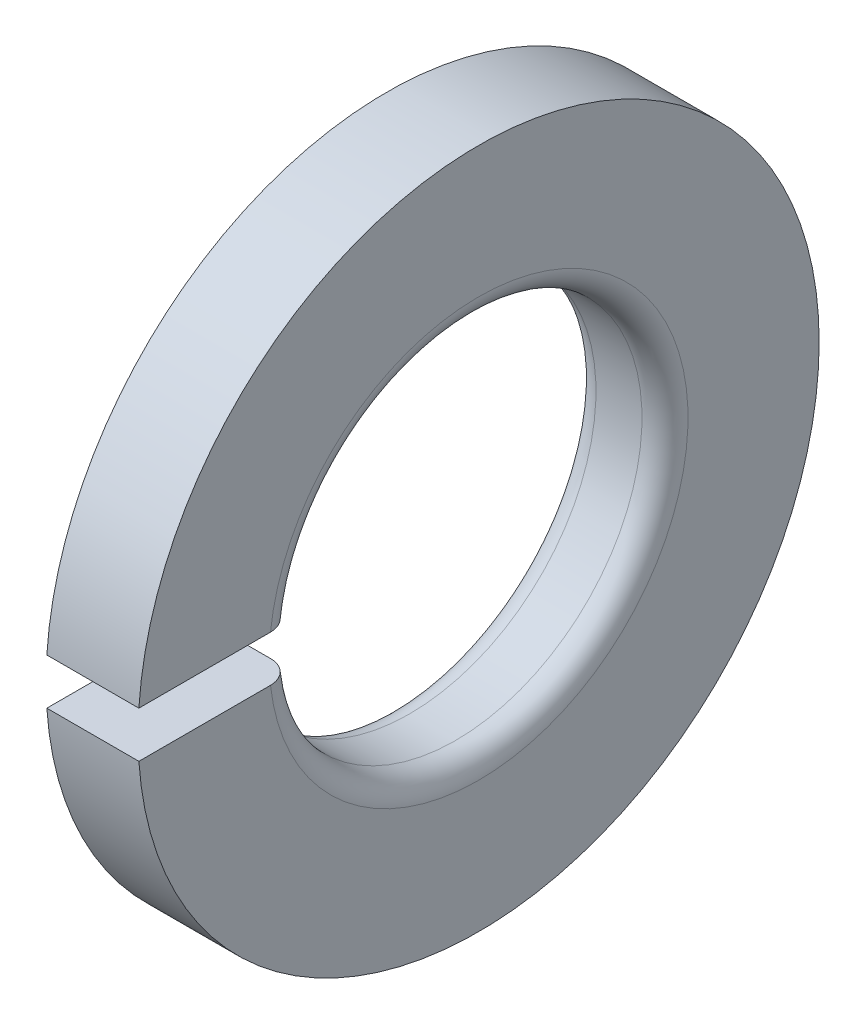
ISO-10303-21;
HEADER;
FILE_DESCRIPTION(('STEP AP214'),'2;1');
FILE_NAME('part.step','',(''),(''),'','','');
FILE_SCHEMA(('AUTOMOTIVE_DESIGN { 1 0 10303 214 1 1 1 1 }'));
ENDSEC;
DATA;
#1=APPLICATION_CONTEXT('core data for automotive mechanical design processes');
#2=APPLICATION_PROTOCOL_DEFINITION('international standard','automotive_design',2000,#1);
#3=PRODUCT_CONTEXT('',#1,'mechanical');
#4=PRODUCT('Part','Part','',(#3));
#5=PRODUCT_RELATED_PRODUCT_CATEGORY('part','',(#4));
#6=PRODUCT_DEFINITION_FORMATION('','',#4);
#7=PRODUCT_DEFINITION_CONTEXT('part definition',#1,'design');
#8=PRODUCT_DEFINITION('design','',#6,#7);
#9=PRODUCT_DEFINITION_SHAPE('','',#8);
#10=(LENGTH_UNIT() NAMED_UNIT(*) SI_UNIT(.MILLI.,.METRE.));
#11=(NAMED_UNIT(*) PLANE_ANGLE_UNIT() SI_UNIT($,.RADIAN.));
#12=(NAMED_UNIT(*) SI_UNIT($,.STERADIAN.) SOLID_ANGLE_UNIT());
#13=UNCERTAINTY_MEASURE_WITH_UNIT(LENGTH_MEASURE(1.E-05),#10,'distance_accuracy_value','');
#14=(GEOMETRIC_REPRESENTATION_CONTEXT(3) GLOBAL_UNCERTAINTY_ASSIGNED_CONTEXT((#13)) GLOBAL_UNIT_ASSIGNED_CONTEXT((#10,
#11,#12)) REPRESENTATION_CONTEXT('',''));
#15=CARTESIAN_POINT('',(0.,0.,0.));
#16=DIRECTION('',(0.,0.,1.));
#17=DIRECTION('',(1.,0.,0.));
#18=AXIS2_PLACEMENT_3D('',#15,#16,#17);
#19=CARTESIAN_POINT('',(-1.99999999999623,0.500000000004719,7.54800000000022));
#20=DIRECTION('',(0.,-1.,0.));
#21=DIRECTION('',(0.,0.,-0.99999999999996));
#22=AXIS2_PLACEMENT_3D('',#19,#20,#21);
#23=PLANE('',#22);
#24=DIRECTION('',(-1.00000000000014,0.,0.));
#25=VECTOR('',#24,1.);
#26=CARTESIAN_POINT('',(-34.9249999999923,0.500000000000833,7.38308878451444));
#27=LINE('',#26,#25);
#28=CARTESIAN_POINT('',(-2.66453525910038E-12,0.50000000000594,7.38308878451033));
#29=VERTEX_POINT('',#28);
#30=CARTESIAN_POINT('',(-1.99999999999534,0.500000000003498,7.38308878451288));
#31=VERTEX_POINT('',#30);
#32=EDGE_CURVE('E301',#29,#31,#27,.T.);
#33=ORIENTED_EDGE('',*,*,#32,.T.);
#34=DIRECTION('',(0.,0.,-0.99999999999996));
#35=VECTOR('',#34,1.);
#36=CARTESIAN_POINT('',(-2.00000000000511,0.500000000011935,7.105427357601E-12));
#37=LINE('',#36,#35);
#38=CARTESIAN_POINT('',(-2.00000000000156,0.499999999992062,4.52244402951574));
#39=VERTEX_POINT('',#38);
#40=EDGE_CURVE('E27',#31,#39,#37,.T.);
#41=ORIENTED_EDGE('',*,*,#40,.T.);
#42=CARTESIAN_POINT('',(-1.5000000000072,0.499999999999545,4.01901729281855));
#43=CARTESIAN_POINT('',(-1.50748561508938,0.499999953272909,4.01901716552028));
#44=CARTESIAN_POINT('',(-1.51497121608091,0.499997602261344,4.01918698453235));
#45=CARTESIAN_POINT('',(-1.53002362041601,0.499989714503642,4.01986976163311));
#46=CARTESIAN_POINT('',(-1.53759022431912,0.499984137017275,4.02038712180304));
#47=CARTESIAN_POINT('',(-1.55278828122433,0.49997121460027,4.02177705523689));
#48=CARTESIAN_POINT('',(-1.56041932685544,0.49996384798885,4.02265408442562));
#49=CARTESIAN_POINT('',(-1.57572878326871,0.499948539550349,4.02477458826429));
#50=CARTESIAN_POINT('',(-1.5834065713466,0.499940591623654,4.02602255983972));
#51=CARTESIAN_POINT('',(-1.59879088195947,0.499925160094014,4.02889548817222));
#52=CARTESIAN_POINT('',(-1.60649655918682,0.499917683556597,4.03052497247465));
#53=CARTESIAN_POINT('',(-1.62191688975636,0.499904042546268,4.0341706122172));
#54=CARTESIAN_POINT('',(-1.62963046847135,0.499897895501641,4.03619131393224));
#55=CARTESIAN_POINT('',(-1.64504573436087,0.499887561105904,4.04062814092714));
#56=CARTESIAN_POINT('',(-1.65274611137995,0.499883398756564,4.04304881889016));
#57=CARTESIAN_POINT('',(-1.668113024944,0.499877465506405,4.04829331243764));
#58=CARTESIAN_POINT('',(-1.67577801018735,0.499875724314375,4.0511216740783));
#59=CARTESIAN_POINT('',(-1.69105114513187,0.499874833876619,4.05718811040265));
#60=CARTESIAN_POINT('',(-1.69865749740467,0.499875716112147,4.06043071085659));
#61=CARTESIAN_POINT('',(-1.71378936982724,0.49988003537121,4.06733095833115));
#62=CARTESIAN_POINT('',(-1.72131284215068,0.499883502756743,4.0709930965461));
#63=CARTESIAN_POINT('',(-1.73625400628867,0.499892677766569,4.07873640808514));
#64=CARTESIAN_POINT('',(-1.74366939633286,0.499898411388501,4.08282202313595));
#65=CARTESIAN_POINT('',(-1.75836856837313,0.499911618149696,4.09141482733663));
#66=CARTESIAN_POINT('',(-1.76564979205833,0.499919110874341,4.0959263932586));
#67=CARTESIAN_POINT('',(-1.78005395439421,0.499934747047213,4.10537208982442));
#68=CARTESIAN_POINT('',(-1.78717407599416,0.499942897037337,4.11031051629181));
#69=CARTESIAN_POINT('',(-1.80122874624811,0.499959646906156,4.12060925946825));
#70=CARTESIAN_POINT('',(-1.80816021968402,0.499968250880354,4.12597377436082));
#71=CARTESIAN_POINT('',(-1.82180918753309,0.499980947236283,4.13712231342917));
#72=CARTESIAN_POINT('',(-1.82852334326952,0.499984987086652,4.14291042164119));
#73=CARTESIAN_POINT('',(-1.84171052376815,0.500000239595588,4.15490174357232));
#74=CARTESIAN_POINT('',(-1.84817996803468,0.500011532761928,4.16110890773137));
#75=CARTESIAN_POINT('',(-1.85631852921631,0.499996625865646,4.16935055511182));
#76=CARTESIAN_POINT('',(-1.85814585930569,0.499991297903434,4.17123049543251));
#77=CARTESIAN_POINT('',(-1.86228406801692,0.499970246712779,4.17555608481707));
#78=CARTESIAN_POINT('',(-1.8645852153982,0.49995200530595,4.17801106197889));
#79=CARTESIAN_POINT('',(-1.86964037825593,0.499909775696944,4.18351397702914));
#80=CARTESIAN_POINT('',(-1.87238217617192,0.499885408016754,4.18657313325353));
#81=CARTESIAN_POINT('',(-1.87827923293826,0.499831937756961,4.19331710505004));
#82=CARTESIAN_POINT('',(-1.88141955911796,0.499802776082484,4.19701498964861));
#83=CARTESIAN_POINT('',(-1.88806510530111,0.499743010873845,4.20507320743247));
#84=CARTESIAN_POINT('',(-1.89155252148393,0.499712870895155,4.20944823644231));
#85=CARTESIAN_POINT('',(-1.89883363819062,0.499654023650828,4.21890066296193));
#86=CARTESIAN_POINT('',(-1.90260647281742,0.49962603875564,4.22399415030097));
#87=CARTESIAN_POINT('',(-1.91038901028965,0.499574572805987,4.23492508430324));
#88=CARTESIAN_POINT('',(-1.91437459372639,0.499552004976681,4.24077971982574));
#89=CARTESIAN_POINT('',(-1.92250163547388,0.499514095421726,4.25327462743974));
#90=CARTESIAN_POINT('',(-1.92661552850864,0.499499761090574,4.25993284982627));
#91=CARTESIAN_POINT('',(-1.93490583138315,0.49948052143504,4.27407452737618));
#92=CARTESIAN_POINT('',(-1.93905103558709,0.499476641518321,4.28157627888969));
#93=CARTESIAN_POINT('',(-1.94729805821081,0.499479679903175,4.2974412262524));
#94=CARTESIAN_POINT('',(-1.95136488761893,0.499487564604471,4.30582268000173));
#95=CARTESIAN_POINT('',(-1.95722771209192,0.499507271593149,4.31880695109538));
#96=CARTESIAN_POINT('',(-1.9591926487224,0.499515501572604,4.32333429622484));
#97=CARTESIAN_POINT('',(-1.96306074256105,0.499534700332774,4.33261641197448));
#98=CARTESIAN_POINT('',(-1.96495877990835,0.499545760649247,4.33737332293312));
#99=CARTESIAN_POINT('',(-1.96867574723157,0.499570403205374,4.34711638993613));
#100=CARTESIAN_POINT('',(-1.97048929895053,0.499584062461406,4.35210459642447));
#101=CARTESIAN_POINT('',(-1.97401927491285,0.49961356999571,4.36231148460286));
#102=CARTESIAN_POINT('',(-1.97573006530324,0.49962947822747,4.36753211558344));
#103=CARTESIAN_POINT('',(-1.97903567750591,0.499663025932473,4.37820410316804));
#104=CARTESIAN_POINT('',(-1.98062460791997,0.499680705796024,4.38365728495089));
#105=CARTESIAN_POINT('',(-1.9836669121791,0.499717203065506,4.39479361691822));
#106=CARTESIAN_POINT('',(-1.9851141378086,0.499736038762799,4.40047844729326));
#107=CARTESIAN_POINT('',(-1.98785272596338,0.499774107811786,4.41207617708927));
#108=CARTESIAN_POINT('',(-1.98913768498556,0.499793334814477,4.41799058920652));
#109=CARTESIAN_POINT('',(-1.99153076984537,0.499831290227347,4.43004433329153));
#110=CARTESIAN_POINT('',(-1.99263223992184,0.499849985104897,4.43618498739852));
#111=CARTESIAN_POINT('',(-1.99463677167566,0.499885813808528,4.44868669887748));
#112=CARTESIAN_POINT('',(-1.99553292974262,0.499902884382857,4.45504886400023));
#113=CARTESIAN_POINT('',(-1.99710474164608,0.499934226852415,4.46798759693777));
#114=CARTESIAN_POINT('',(-1.99777325036995,0.499948403273798,4.47456503365268));
#115=CARTESIAN_POINT('',(-1.99886719354286,0.499972534738432,4.48792670984609));
#116=CARTESIAN_POINT('',(-1.99928524831778,0.499982359583994,4.49471155440364));
#117=CARTESIAN_POINT('',(-1.99985549590138,0.499996177224051,4.50847872578808));
#118=CARTESIAN_POINT('',(-2.0000000876899,0.500000002788135,4.51546136830327));
#119=CARTESIAN_POINT('',(-2.00000000000728,0.499999999999558,4.52244402950122));
#120=B_SPLINE_CURVE_WITH_KNOTS('',3,(#42,#43,#44,#45,#46,#47,#48,#49,#50,#51,#52,#53,#54,#55,
#56,#57,#58,#59,#60,#61,#62,#63,#64,#65,#66,#67,#68,#69,#70,#71,#72,#73,#74,#75,#76,#77,#78,#79,
#80,#81,#82,#83,#84,#85,#86,#87,#88,#89,#90,#91,#92,#93,#94,#95,#96,#97,#98,#99,#100,#101,#102,
#103,#104,#105,#106,#107,#108,#109,#110,#111,#112,#113,#114,#115,#116,#117,#118,#119),
.UNSPECIFIED.,.F.,.F.,(4,2,2,2,2,2,2,2,2,2,2,2,2,2,2,2,2,2,2,2,2,2,2,2,2,2,2,2,2,2,2,2,2,2,2,2,
2,2,4),(0.,0.0224549112175778,0.0451997457757097,0.0682353125981372,0.0915623954254549,
0.115181756728255,0.139094141520749,0.163300281070073,0.187800896495049,0.212596702246624,
0.237688409460583,0.263076729171398,0.288762375374257,0.314746067920404,0.341028535228959,
0.367610516796397,0.394492765482802,0.402357690103795,0.412451617757568,0.424774711493981,
0.439327115464466,0.45610898049943,0.475120476895091,0.496361802576542,0.519833189257198,
0.545534907487324,0.573467270828169,0.58827164010673,0.603633995305254,0.619554402975488,
0.636032933246071,0.653069659796546,0.670664659796565,0.688818013805997,0.707529805631366,
0.726800122133813,0.746629052983607,0.767016690356106,0.787963128563953),.UNSPECIFIED.);
#121=CARTESIAN_POINT('',(-1.50000000002137,0.500000000001832,4.01901729281673));
#122=VERTEX_POINT('',#121);
#123=EDGE_CURVE('E203',#122,#39,#120,.T.);
#124=ORIENTED_EDGE('',*,*,#123,.F.);
#125=DIRECTION('',(1.00000000000014,0.,0.));
#126=VECTOR('',#125,1.);
#127=CARTESIAN_POINT('',(-34.9250000000021,0.499999999995615,4.01901729281862));
#128=LINE('',#127,#126);
#129=CARTESIAN_POINT('',(-0.500000000014822,0.500000000000944,4.0190172928124));
#130=VERTEX_POINT('',#129);
#131=EDGE_CURVE('E96',#122,#130,#128,.T.);
#132=ORIENTED_EDGE('',*,*,#131,.T.);
#133=CARTESIAN_POINT('',(-4.13829127215992E-12,0.499999999999658,4.52244402950488));
#134=CARTESIAN_POINT('',(8.78582804622334E-08,0.500000002788944,4.5154578184117));
#135=CARTESIAN_POINT('',(-0.000144651072075563,0.49999617098689,4.50847162602091));
#136=CARTESIAN_POINT('',(-0.00071548582687301,0.49998233026018,4.49469729296484));
#137=CARTESIAN_POINT('',(-0.00113397994639846,0.499972488693761,4.48790883642249));
#138=CARTESIAN_POINT('',(-0.00222909145849578,0.499948315243477,4.47453989133131));
#139=CARTESIAN_POINT('',(-0.0028983283327819,0.499934113671153,4.46795879731763));
#140=CARTESIAN_POINT('',(-0.00447188137272107,0.499902714329723,4.45501272057473));
#141=CARTESIAN_POINT('',(-0.00536905143986357,0.499885612133517,4.44864686835663));
#142=CARTESIAN_POINT('',(-0.00737588612132155,0.499849715481703,4.4361377678786));
#143=CARTESIAN_POINT('',(-0.00847864600981831,0.499830984361436,4.42999341107155));
#144=CARTESIAN_POINT('',(-0.0108745824688362,0.499792953503831,4.41793225980601));
#145=CARTESIAN_POINT('',(-0.0121611020459157,0.499773687366853,4.41201414220119));
#146=CARTESIAN_POINT('',(-0.0149030754484896,0.499735538704053,4.40040901127226));
#147=CARTESIAN_POINT('',(-0.0163521244331994,0.499716662578951,4.39472048403216));
#148=CARTESIAN_POINT('',(-0.0193983309376364,0.499680084582847,4.3835767783776));
#149=CARTESIAN_POINT('',(-0.0209893388093471,0.499662364456277,4.37811991833947));
#150=CARTESIAN_POINT('',(-0.0242993522275669,0.499628737681773,4.36744060304097));
#151=CARTESIAN_POINT('',(-0.0260124648580352,0.499612790663728,4.36221632095584));
#152=CARTESIAN_POINT('',(-0.0295473218063634,0.499583208188126,4.35200216673041));
#153=CARTESIAN_POINT('',(-0.0313634306772503,0.49956951278226,4.34701034344143));
#154=CARTESIAN_POINT('',(-0.0350857387109606,0.499544801578208,4.3372600847776));
#155=CARTESIAN_POINT('',(-0.0369865579514607,0.499533708754553,4.33249959689341));
#156=CARTESIAN_POINT('',(-0.0408604311355706,0.499514449486569,4.32321037420345));
#157=CARTESIAN_POINT('',(-0.0428283634971406,0.499506191484338,4.31867949677905));
#158=CARTESIAN_POINT('',(-0.0487004600756688,0.499486409213047,4.30568456103192));
#159=CARTESIAN_POINT('',(-0.0527738863633262,0.499478483934712,4.2972961751318));
#160=CARTESIAN_POINT('',(-0.0610348417885195,0.499475389270068,4.28141758425333));
#161=CARTESIAN_POINT('',(-0.065187366826513,0.499479253049495,4.27390909836512));
#162=CARTESIAN_POINT('',(-0.0734929634913855,0.499498486518159,4.25975416104117));
#163=CARTESIAN_POINT('',(-0.0776148135456418,0.499512830275646,4.25308938734216));
#164=CARTESIAN_POINT('',(-0.0857583341512029,0.499550783604497,4.2405815577697));
#165=CARTESIAN_POINT('',(-0.0897524226691077,0.49957338523884,4.23472052287831));
#166=CARTESIAN_POINT('',(-0.0975524499065559,0.499624940107158,4.22377692454164));
#167=CARTESIAN_POINT('',(-0.101334251517573,0.499652979664338,4.21867714093173));
#168=CARTESIAN_POINT('',(-0.108633698546621,0.499711952193922,4.20921219447099));
#169=CARTESIAN_POINT('',(-0.112130459257786,0.499742162469756,4.20483090811444));
#170=CARTESIAN_POINT('',(-0.118795009550483,0.499802075833275,4.19676017242977));
#171=CARTESIAN_POINT('',(-0.121944975137716,0.499831315459909,4.1930559914486));
#172=CARTESIAN_POINT('',(-0.127861545397101,0.499884942108848,4.18629933551338));
#173=CARTESIAN_POINT('',(-0.130613195609282,0.499909388017785,4.18323375382062));
#174=CARTESIAN_POINT('',(-0.135688217901568,0.499951759090465,4.17771779770785));
#175=CARTESIAN_POINT('',(-0.137999348545125,0.499970065217768,4.17525616552488));
#176=CARTESIAN_POINT('',(-0.142157595961802,0.4999912278129,4.17091696863508));
#177=CARTESIAN_POINT('',(-0.143994955674154,0.49999659694027,4.1690300352828));
#178=CARTESIAN_POINT('',(-0.152140091847633,0.500011561307792,4.16079683117086));
#179=CARTESIAN_POINT('',(-0.158605284749574,0.500000430581791,4.15460461343572));
#180=CARTESIAN_POINT('',(-0.171783033968526,0.49998542728062,4.14264199210805));
#181=CARTESIAN_POINT('',(-0.178492036463244,0.499981475305023,4.13686766095693));
#182=CARTESIAN_POINT('',(-0.192129906643335,0.499968961029165,4.12574546849947));
#183=CARTESIAN_POINT('',(-0.199055460483642,0.499960450984341,4.12039354722201));
#184=CARTESIAN_POINT('',(-0.213097644077318,0.499943866107831,4.11011877979264));
#185=CARTESIAN_POINT('',(-0.220211221390249,0.499935787438632,4.10519176054492));
#186=CARTESIAN_POINT('',(-0.234601782545235,0.499920273258884,4.09576767537517));
#187=CARTESIAN_POINT('',(-0.241875970113177,0.499912831453615,4.09126633956999));
#188=CARTESIAN_POINT('',(-0.256560686353494,0.499899702179977,4.08269281183593));
#189=CARTESIAN_POINT('',(-0.263968675488303,0.499893995470885,4.07861626976814));
#190=CARTESIAN_POINT('',(-0.278894775887238,0.499884849925421,4.07088994966593));
#191=CARTESIAN_POINT('',(-0.28641060217731,0.499881385468387,4.06723575707673));
#192=CARTESIAN_POINT('',(-0.301527034630219,0.499877048740609,4.0603502844622));
#193=CARTESIAN_POINT('',(-0.309125607817531,0.499876146498073,4.05711454080666));
#194=CARTESIAN_POINT('',(-0.324383142631468,0.499876976217089,4.05106074772426));
#195=CARTESIAN_POINT('',(-0.332040319776743,0.49987867706973,4.04823820034434));
#196=CARTESIAN_POINT('',(-0.347391672792108,0.499884512844785,4.04300431790366));
#197=CARTESIAN_POINT('',(-0.355084308453213,0.499888618385357,4.04058846472569));
#198=CARTESIAN_POINT('',(-0.370484236354603,0.499898827476793,4.03616032876214));
#199=CARTESIAN_POINT('',(-0.378190227734414,0.499904906279511,4.03414352123092));
#200=CARTESIAN_POINT('',(-0.393595608818486,0.499918405289573,4.03050477519817));
#201=CARTESIAN_POINT('',(-0.401293931455855,0.499925808221696,4.02887831824253));
#202=CARTESIAN_POINT('',(-0.416663829886207,0.499941094113053,4.02601061791647));
#203=CARTESIAN_POINT('',(-0.424334566265778,0.499948970032831,4.02476487459816));
#204=CARTESIAN_POINT('',(-0.439630279513462,0.499964143949599,4.02264807185205));
#205=CARTESIAN_POINT('',(-0.447254637978504,0.499971447918642,4.02177254277265));
#206=CARTESIAN_POINT('',(-0.462439735522376,0.499984262999869,4.02038492766572));
#207=CARTESIAN_POINT('',(-0.470000070016233,0.499989795489107,4.01986841257786));
#208=CARTESIAN_POINT('',(-0.485040397063862,0.499997620663045,4.01918671956441));
#209=CARTESIAN_POINT('',(-0.49252019152618,0.499999953573932,4.01901716591152));
#210=CARTESIAN_POINT('',(-0.500000000004204,0.499999999999656,4.01901729282222));
#211=B_SPLINE_CURVE_WITH_KNOTS('',3,(#133,#134,#135,#136,#137,#138,#139,#140,#141,#142,#143,
#144,#145,#146,#147,#148,#149,#150,#151,#152,#153,#154,#155,#156,#157,#158,#159,#160,#161,#162,
#163,#164,#165,#166,#167,#168,#169,#170,#171,#172,#173,#174,#175,#176,#177,#178,#179,#180,#181,
#182,#183,#184,#185,#186,#187,#188,#189,#190,#191,#192,#193,#194,#195,#196,#197,#198,#199,#200,
#201,#202,#203,#204,#205,#206,#207,#208,#209,#210),.UNSPECIFIED.,.F.,.F.,(4,2,2,2,2,2,2,2,2,2,2,
2,2,2,2,2,2,2,2,2,2,2,2,2,2,2,2,2,2,2,2,2,2,2,2,2,2,2,4),(0.,0.0209570855649429,
0.0413556106550284,0.0611956696427081,0.0804773547659454,0.0992007557597671,0.117365959551616,
0.13497305001533,0.152022107778639,0.168513210079185,0.184446430664288,0.199821839729865,
0.214639503894216,0.242599172471596,0.268329161752777,0.291829785775131,0.313101315542838,
0.332143983209899,0.34895798714381,0.363543498108731,0.37590066746475,0.386029640006872,
0.393930579593988,0.420772661026481,0.44731600522424,0.473561363143571,0.499509472434382,
0.525161059714043,0.550516843062365,0.575577534717071,0.600343843951035,0.624816480114624,
0.648996155828348,0.672883590312971,0.696479512845962,0.719784666334935,0.742799811000282,
0.765525728160772,0.787963224117252),.UNSPECIFIED.);
#212=CARTESIAN_POINT('',(-8.88178419700125E-13,0.499999999987066,4.52244402951296));
#213=VERTEX_POINT('',#212);
#214=EDGE_CURVE('E125',#213,#130,#211,.T.);
#215=ORIENTED_EDGE('',*,*,#214,.F.);
#216=DIRECTION('',(0.,0.,-0.99999999999996));
#217=VECTOR('',#216,1.);
#218=CARTESIAN_POINT('',(5.32907051820075E-12,0.500000000012824,7.548));
#219=LINE('',#218,#217);
#220=EDGE_CURVE('E130',#29,#213,#219,.T.);
#221=ORIENTED_EDGE('',*,*,#220,.F.);
#222=EDGE_LOOP('',(#33,#41,#124,#132,#215,#221));
#223=FACE_BOUND('',#222,.T.);
#224=ADVANCED_FACE('F16',(#223),#23,.T.);
#225=CARTESIAN_POINT('',(-2.0000000000131,-0.499999999994061,2.77555756156289E-12));
#226=DIRECTION('',(0.,1.,0.));
#227=DIRECTION('',(1.00000000000014,0.,0.));
#228=AXIS2_PLACEMENT_3D('',#225,#226,#227);
#229=PLANE('',#228);
#230=DIRECTION('',(1.00000000000014,0.,0.));
#231=VECTOR('',#230,1.);
#232=CARTESIAN_POINT('',(-34.9249999999945,-0.499999999988621,7.38308878451621));
#233=LINE('',#232,#231);
#234=CARTESIAN_POINT('',(-1.99999999998646,-0.499999999988954,7.38308878450467));
#235=VERTEX_POINT('',#234);
#236=CARTESIAN_POINT('',(2.66453525910038E-12,-0.50000000000272,7.3830887845111));
#237=VERTEX_POINT('',#236);
#238=EDGE_CURVE('E118',#235,#237,#233,.T.);
#239=ORIENTED_EDGE('',*,*,#238,.T.);
#240=DIRECTION('',(0.,0.,0.99999999999996));
#241=VECTOR('',#240,1.);
#242=CARTESIAN_POINT('',(1.68753899743024E-11,-0.500000000002498,4.10782519111308E-12));
#243=LINE('',#242,#241);
#244=CARTESIAN_POINT('',(-7.105427357601E-12,-0.500000000010159,4.52244402949986));
#245=VERTEX_POINT('',#244);
#246=EDGE_CURVE('E89',#245,#237,#243,.T.);
#247=ORIENTED_EDGE('',*,*,#246,.F.);
#248=CARTESIAN_POINT('',(-0.500000000004214,-0.500000000000453,4.01901729282223));
#249=CARTESIAN_POINT('',(-0.492514516692793,-0.499999953278564,4.01901716553286));
#250=CARTESIAN_POINT('',(-0.485029047470629,-0.49999760248498,4.01918697854489));
#251=CARTESIAN_POINT('',(-0.469976912546314,-0.49998971546219,4.01986973133121));
#252=CARTESIAN_POINT('',(-0.462410446263705,-0.499984138498659,4.02038707280279));
#253=CARTESIAN_POINT('',(-0.447212669542019,-0.499971217299528,4.0217769554587));
#254=CARTESIAN_POINT('',(-0.439581766430841,-0.499963851386319,4.02265395217703));
#255=CARTESIAN_POINT('',(-0.424272598948772,-0.499948544408026,4.02477437668269));
#256=CARTESIAN_POINT('',(-0.416594957215767,-0.499940597244271,4.02602230099944));
#257=CARTESIAN_POINT('',(-0.401210942007636,-0.499925167207225,4.02889511946222));
#258=CARTESIAN_POINT('',(-0.393505413749372,-0.499917691398513,4.03052454075364));
#259=CARTESIAN_POINT('',(-0.378085382531681,-0.499904051730991,4.03417003822963));
#260=CARTESIAN_POINT('',(-0.370371954083294,-0.499897905298022,4.03619066028682));
#261=CARTESIAN_POINT('',(-0.354956988715052,-0.499887571946758,4.04062731090902));
#262=CARTESIAN_POINT('',(-0.347256761808152,-0.499883410026689,4.04304789175422));
#263=CARTESIAN_POINT('',(-0.331890146908525,-0.499877477411161,4.04829217329017));
#264=CARTESIAN_POINT('',(-0.324225310047751,-0.499875736420257,4.0511204196353));
#265=CARTESIAN_POINT('',(-0.308952468641225,-0.499874846136971,4.05718660698126));
#266=CARTESIAN_POINT('',(-0.301346261326244,-0.499875728321332,4.06042907335357));
#267=CARTESIAN_POINT('',(-0.286214673810229,-0.499880047228918,4.06732903378788));
#268=CARTESIAN_POINT('',(-0.278691341209399,-0.499883514309767,4.0709910186505));
#269=CARTESIAN_POINT('',(-0.263750449616649,-0.499892688486061,4.07873400425463));
#270=CARTESIAN_POINT('',(-0.256335192139923,-0.499898421575366,4.08281944633636));
#271=CARTESIAN_POINT('',(-0.241636276343165,-0.499911627092163,4.09141188516601));
#272=CARTESIAN_POINT('',(-0.234355176049448,-0.499919119102157,4.09592325830897));
#273=CARTESIAN_POINT('',(-0.219951249518596,-0.499934753763611,4.10536854984816));
#274=CARTESIAN_POINT('',(-0.212831240018,-0.499942902955861,4.11030676370265));
#275=CARTESIAN_POINT('',(-0.198776780827672,-0.499959651180304,4.12060506232445));
#276=CARTESIAN_POINT('',(-0.191845406012349,-0.499968254307411,4.12596934492417));
#277=CARTESIAN_POINT('',(-0.178196620001634,-0.499980949339561,4.13711740042972));
#278=CARTESIAN_POINT('',(-0.171482547109236,-0.499984988719919,4.14290525703754));
#279=CARTESIAN_POINT('',(-0.1582955147325,-0.500000239747937,4.15489605727622));
#280=CARTESIAN_POINT('',(-0.15182613534306,-0.500011531893863,4.16110295103151));
#281=CARTESIAN_POINT('',(-0.143687452751211,-0.499996625773217,4.16934443371154));
#282=CARTESIAN_POINT('',(-0.141859950390002,-0.499991297476857,4.17122448791701));
#283=CARTESIAN_POINT('',(-0.13772139435849,-0.499970244963326,4.17555029977723));
#284=CARTESIAN_POINT('',(-0.135420072391456,-0.499952002577207,4.17800538627617));
#285=CARTESIAN_POINT('',(-0.130364559116759,-0.499909770726429,4.18350851673014));
#286=CARTESIAN_POINT('',(-0.127622585811395,-0.499885401737014,4.18656777976557));
#287=CARTESIAN_POINT('',(-0.121725178568785,-0.499831928750361,4.19331196388007));
#288=CARTESIAN_POINT('',(-0.118584677725627,-0.499802765643592,4.19700995472112));
#289=CARTESIAN_POINT('',(-0.111938784116406,-0.499742997628563,4.20506838552854));
#290=CARTESIAN_POINT('',(-0.108451195585331,-0.499712856268424,4.20944352204106));
#291=CARTESIAN_POINT('',(-0.101169737759575,-0.499654006470505,4.21889616579331));
#292=CARTESIAN_POINT('',(-0.0973967347740921,-0.499626020408109,4.2239897635639));
#293=CARTESIAN_POINT('',(-0.0896138659428158,-0.499574552453411,4.2349209221481));
#294=CARTESIAN_POINT('',(-0.0856281199222897,-0.499551983797788,4.24077567249636));
#295=CARTESIAN_POINT('',(-0.077500760264854,-0.499514073009639,4.25327081473514));
#296=CARTESIAN_POINT('',(-0.0733867123303384,-0.499499738287373,4.25992915756328));
#297=CARTESIAN_POINT('',(-0.0650961089460411,-0.499480498319797,4.27407108192649));
#298=CARTESIAN_POINT('',(-0.0609507595729911,-0.499476618499263,4.2815729604138));
#299=CARTESIAN_POINT('',(-0.0527034580337197,-0.499479657553798,4.29743816831832));
#300=CARTESIAN_POINT('',(-0.0486364953361682,-0.499487542844813,4.30581975619187));
#301=CARTESIAN_POINT('',(-0.0427734823761156,-0.499507251028115,4.31880423508646));
#302=CARTESIAN_POINT('',(-0.040808484336358,-0.499515481467408,4.32333164990631));
#303=CARTESIAN_POINT('',(-0.0369402714484293,-0.499534681246177,4.33261390679251));
#304=CARTESIAN_POINT('',(-0.0350421765217107,-0.499545742122786,4.33737088925604));
#305=CARTESIAN_POINT('',(-0.0313250981099877,-0.499570385883983,4.3471141009723));
#306=CARTESIAN_POINT('',(-0.0295114929437945,-0.499584045786009,4.35210238072339));
#307=CARTESIAN_POINT('',(-0.025981414452358,-0.499613554679127,4.36230941705893));
#308=CARTESIAN_POINT('',(-0.0242705750429202,-0.499629463624399,4.36753012298398));
#309=CARTESIAN_POINT('',(-0.0209648694649667,-0.499663012801555,4.37820226198184));
#310=CARTESIAN_POINT('',(-0.0193758947584583,-0.499680693424032,4.38365552027889));
#311=CARTESIAN_POINT('',(-0.0163335068722065,-0.499717192230928,4.3947920066587));
#312=CARTESIAN_POINT('',(-0.0148862419725946,-0.499736028706548,4.40047691497255));
#313=CARTESIAN_POINT('',(-0.0121475805263276,-0.499774099302326,4.41207480185475));
#314=CARTESIAN_POINT('',(-0.0108625875479291,-0.499793327072839,4.41798929315476));
#315=CARTESIAN_POINT('',(-0.00846944030842173,-0.499831283978202,4.43004319660222));
#316=CARTESIAN_POINT('',(-0.00736794187403212,-0.499849979579268,4.4361839309189));
#317=CARTESIAN_POINT('',(-0.00536335921149309,-0.499885809649654,4.44868580356536));
#318=CARTESIAN_POINT('',(-0.00446717865945812,-0.499902880865529,4.4550480496703));
#319=CARTESIAN_POINT('',(-0.00289532785400801,-0.499934224497015,4.46798694503362));
#320=CARTESIAN_POINT('',(-0.00222680277881993,-0.499948401436526,4.47456446321068));
#321=CARTESIAN_POINT('',(-0.00113283321769496,-0.499972533771723,4.48792630246468));
#322=CARTESIAN_POINT('',(-0.000714768471037877,-0.499982358966888,4.49471122863322));
#323=CARTESIAN_POINT('',(-0.000144507478681713,-0.499996177092483,4.50847856301194));
#324=CARTESIAN_POINT('',(8.76825837822212E-08,-0.500000002789081,4.51546128691676));
#325=CARTESIAN_POINT('',(-4.14902487366753E-12,-0.500000000000463,4.52244402950489));
#326=B_SPLINE_CURVE_WITH_KNOTS('',3,(#248,#249,#250,#251,#252,#253,#254,#255,#256,#257,#258,
#259,#260,#261,#262,#263,#264,#265,#266,#267,#268,#269,#270,#271,#272,#273,#274,#275,#276,#277,
#278,#279,#280,#281,#282,#283,#284,#285,#286,#287,#288,#289,#290,#291,#292,#293,#294,#295,#296,
#297,#298,#299,#300,#301,#302,#303,#304,#305,#306,#307,#308,#309,#310,#311,#312,#313,#314,#315,
#316,#317,#318,#319,#320,#321,#322,#323,#324,#325),.UNSPECIFIED.,.F.,.F.,(4,2,2,2,2,2,2,2,2,2,2,
2,2,2,2,2,2,2,2,2,2,2,2,2,2,2,2,2,2,2,2,2,2,2,2,2,2,2,4),(0.,0.0224545160082259,
0.0451989352772645,0.0682340666817542,0.0915606939160324,0.115179579406804,0.139091468126307,
0.163297091301187,0.18779717001083,0.212592418667419,0.237683548368258,0.263071270109286,
0.288756297846764,0.314739351392321,0.341021159124508,0.367602460498032,0.394484008329813,
0.402349538100575,0.412444063137665,0.424767746508177,0.439320732376236,0.45610317158235,
0.475115234431536,0.496357118857257,0.519829056581385,0.54553131816311,0.573464217173288,
0.588268851494341,0.60363146982464,0.619552138717506,0.636030928303206,0.653067912262945,
0.670663167768078,0.688816775380208,0.707528818907609,0.726799385213184,0.74662856396897,
0.767016447352068,0.787963129676835),.UNSPECIFIED.);
#327=CARTESIAN_POINT('',(-0.500000000000611,-0.500000000007605,4.01901729281917));
#328=VERTEX_POINT('',#327);
#329=EDGE_CURVE('E104',#328,#245,#326,.T.);
#330=ORIENTED_EDGE('',*,*,#329,.F.);
#331=DIRECTION('',(-1.00000000000014,0.,0.));
#332=VECTOR('',#331,1.);
#333=CARTESIAN_POINT('',(-34.9250000000061,-0.500000000003165,4.01901729282539));
#334=LINE('',#333,#332);
#335=CARTESIAN_POINT('',(-1.50000000000272,-0.49999999999939,4.01901729282927));
#336=VERTEX_POINT('',#335);
#337=EDGE_CURVE('E204',#328,#336,#334,.T.);
#338=ORIENTED_EDGE('',*,*,#337,.T.);
#339=CARTESIAN_POINT('',(-2.00000000000729,-0.500000000000564,4.52244402950123));
#340=CARTESIAN_POINT('',(-2.00000008777088,-0.500000002788951,4.51545977461373));
#341=CARTESIAN_POINT('',(-1.99985542993369,-0.499996174167634,4.50847553841541));
#342=CARTESIAN_POINT('',(-1.99928491753434,-0.499982345091617,4.49470512191826));
#343=CARTESIAN_POINT('',(-1.99886666309377,-0.499972511912463,4.48791862589656));
#344=CARTESIAN_POINT('',(-1.99777218574158,-0.499948359342374,4.47455359697738));
#345=CARTESIAN_POINT('',(-1.99710334174565,-0.499934170194653,4.46797445891966));
#346=CARTESIAN_POINT('',(-1.99553072325763,-0.499902798708575,4.45503228112787));
#347=CARTESIAN_POINT('',(-1.99463409325354,-0.499885711888854,4.44866837235534));
#348=CARTESIAN_POINT('',(-1.99262848112432,-0.499849847986302,4.43616313865446));
#349=CARTESIAN_POINT('',(-1.99152640211357,-0.49983113419819,4.43002070577027));
#350=CARTESIAN_POINT('',(-1.98913196314067,-0.499793139083473,4.41796337601078));
#351=CARTESIAN_POINT('',(-1.98784625856662,-0.499773891329703,4.41204715671588));
#352=CARTESIAN_POINT('',(-1.98510604396995,-0.499735779688307,4.40044579075038));
#353=CARTESIAN_POINT('',(-1.98365793719474,-0.499716922186318,4.3947591310202));
#354=CARTESIAN_POINT('',(-1.98061373680979,-0.499680380962907,4.38361912429552));
#355=CARTESIAN_POINT('',(-1.97902379127173,-0.499662678982512,4.37816409665749));
#356=CARTESIAN_POINT('',(-1.97571601702459,-0.499629087393375,4.36748840649837));
#357=CARTESIAN_POINT('',(-1.97400407967631,-0.499613157421936,4.36226591825011));
#358=CARTESIAN_POINT('',(-1.97047168053985,-0.49958360739392,4.35205530927025));
#359=CARTESIAN_POINT('',(-1.9686568526682,-0.499569927406298,4.34706523859912));
#360=CARTESIAN_POINT('',(-1.96493720668872,-0.499545244946588,4.33731844084474));
#361=CARTESIAN_POINT('',(-1.9630377669987,-0.499534165475117,4.33255966256487));
#362=CARTESIAN_POINT('',(-1.95916674562819,-0.499514930467863,4.32327381332947));
#363=CARTESIAN_POINT('',(-1.95720028405798,-0.499506683407828,4.31874460117124));
#364=CARTESIAN_POINT('',(-1.95133270048655,-0.499486929528382,4.3057546282535));
#365=CARTESIAN_POINT('',(-1.94726246486901,-0.499479018217583,4.29736944447392));
#366=CARTESIAN_POINT('',(-1.93900818378055,-0.499475939270764,4.28149707005884));
#367=CARTESIAN_POINT('',(-1.93485913134757,-0.499479805195549,4.27399161190573));
#368=CARTESIAN_POINT('',(-1.92656072070752,-0.499499030887814,4.25984255624021));
#369=CARTESIAN_POINT('',(-1.92244257342857,-0.499513365139453,4.25318065094358));
#370=CARTESIAN_POINT('',(-1.91430664960126,-0.499551288691323,4.24067840556705));
#371=CARTESIAN_POINT('',(-1.91031644481955,-0.499573870437054,4.23482010190284));
#372=CARTESIAN_POINT('',(-1.90252433019469,-0.499625377140326,4.22388184206321));
#373=CARTESIAN_POINT('',(-1.89874654745741,-0.499653388700681,4.21878468192376));
#374=CARTESIAN_POINT('',(-1.89145524040921,-0.499712300056879,4.20932489303266));
#375=CARTESIAN_POINT('',(-1.88796259093627,-0.499742477275597,4.20494615758388));
#376=CARTESIAN_POINT('',(-1.88130632534317,-0.49980232355055,4.19688047388061));
#377=CARTESIAN_POINT('',(-1.87816052332063,-0.499831528969934,4.19317881123924));
#378=CARTESIAN_POINT('',(-1.87225230468086,-0.499885090598686,4.18642718559061));
#379=CARTESIAN_POINT('',(-1.86950483243424,-0.499909505333841,4.18336413342276));
#380=CARTESIAN_POINT('',(-1.86443815454852,-0.499951823104485,4.17785327654002));
#381=CARTESIAN_POINT('',(-1.86213117984087,-0.499970105983016,4.17539423183102));
#382=CARTESIAN_POINT('',(-1.8579811973598,-0.499991237472366,4.171060298262));
#383=CARTESIAN_POINT('',(-1.8561479356627,-0.499996598888461,4.16917605855052));
#384=CARTESIAN_POINT('',(-1.84800568863338,-0.50001158292837,4.16093891588364));
#385=CARTESIAN_POINT('',(-1.841538953799,-0.500000429637679,4.15474026060717));
#386=CARTESIAN_POINT('',(-1.82835768291712,-0.499985393710185,4.14276521726606));
#387=CARTESIAN_POINT('',(-1.82164671013538,-0.499981431458098,4.13698489422055));
#388=CARTESIAN_POINT('',(-1.80800451405665,-0.499968887330954,4.12585118382155));
#389=CARTESIAN_POINT('',(-1.80107661341215,-0.499960357870743,4.12049372863252));
#390=CARTESIAN_POINT('',(-1.78702940596886,-0.499943735039531,4.11020836861904));
#391=CARTESIAN_POINT('',(-1.77991315971068,-0.499935637820757,4.10527628243657));
#392=CARTESIAN_POINT('',(-1.76551698289766,-0.499920088309809,4.09584254287504));
#393=CARTESIAN_POINT('',(-1.75823985602303,-0.499912629699665,4.09133661101614));
#394=CARTESIAN_POINT('',(-1.74354903423535,-0.499899470997107,4.08275437062755));
#395=CARTESIAN_POINT('',(-1.73613788556815,-0.499893751598715,4.07867370308366));
#396=CARTESIAN_POINT('',(-1.72120528776832,-0.49988458600671,4.070939607393));
#397=CARTESIAN_POINT('',(-1.71368612962601,-0.499881114105529,4.06728175559275));
#398=CARTESIAN_POINT('',(-1.69856290135862,-0.499876768479872,4.06038943215365));
#399=CARTESIAN_POINT('',(-1.69096086954128,-0.499875864682328,4.05715048761501));
#400=CARTESIAN_POINT('',(-1.67569632900423,-0.499876697294406,4.05109074926005));
#401=CARTESIAN_POINT('',(-1.66803560942568,-0.499878402490182,4.04826544810035));
#402=CARTESIAN_POINT('',(-1.65267712400613,-0.499884252412816,4.04302650050176));
#403=CARTESIAN_POINT('',(-1.64498090237612,-0.499888367658937,4.04060832648216));
#404=CARTESIAN_POINT('',(-1.6295737930877,-0.499898600557706,4.0361759744985));
#405=CARTESIAN_POINT('',(-1.6218642096513,-0.499904693379148,4.03415726229709));
#406=CARTESIAN_POINT('',(-1.60645167017553,-0.499918223282073,4.03051511353409));
#407=CARTESIAN_POINT('',(-1.59874978394386,-0.49992564303069,4.02888714904074));
#408=CARTESIAN_POINT('',(-1.58337281624684,-0.499940963444095,4.0260168192149));
#409=CARTESIAN_POINT('',(-1.57569857633689,-0.499948857046496,4.02476994451031));
#410=CARTESIAN_POINT('',(-1.56039594316145,-0.499964064856173,4.02265124183176));
#411=CARTESIAN_POINT('',(-1.55276816986592,-0.499971385056641,4.02177493487271));
#412=CARTESIAN_POINT('',(-1.53757635600292,-0.499984228479616,4.02038610282633));
#413=CARTESIAN_POINT('',(-1.53001272103782,-0.499989773152356,4.01986913946805));
#414=CARTESIAN_POINT('',(-1.51496592967691,-0.499997615462372,4.01918686329046));
#415=CARTESIAN_POINT('',(-1.50748297186643,-0.499999953462845,4.01901716569449));
#416=CARTESIAN_POINT('',(-1.50000000000721,-0.500000000000564,4.01901729281856));
#417=B_SPLINE_CURVE_WITH_KNOTS('',3,(#339,#340,#341,#342,#343,#344,#345,#346,#347,#348,#349,
#350,#351,#352,#353,#354,#355,#356,#357,#358,#359,#360,#361,#362,#363,#364,#365,#366,#367,#368,
#369,#370,#371,#372,#373,#374,#375,#376,#377,#378,#379,#380,#381,#382,#383,#384,#385,#386,#387,
#388,#389,#390,#391,#392,#393,#394,#395,#396,#397,#398,#399,#400,#401,#402,#403,#404,#405,#406,
#407,#408,#409,#410,#411,#412,#413,#414,#415,#416),.UNSPECIFIED.,.F.,.F.,(4,2,2,2,2,2,2,2,2,2,2,
2,2,2,2,2,2,2,2,2,2,2,2,2,2,2,2,2,2,2,2,2,2,2,2,2,2,2,4),(0.,0.020951218238018,
0.0413438334476652,0.0611779399598141,0.0804536299701223,0.099170993170972,0.117330116447159,
0.134931083630161,0.151973975305882,0.168458868670881,0.184385837432295,0.199754951746887,
0.214566278194924,0.242513145980282,0.268230161660935,0.291717639043968,0.31297584891989,
0.332005023240117,0.348805360172039,0.363377030269121,0.375720184649973,0.385834967805532,
0.393721543181273,0.420580297244133,0.447139828267308,0.473400888241535,0.499364215817692,
0.525030538585418,0.550400575573735,0.5754750399529,0.60025464191876,0.624740091742816,
0.648932102973206,0.672831395773668,0.696438700389363,0.719754760730163,0.742780338063603,
0.765516214811245,0.787963198443615),.UNSPECIFIED.);
#418=CARTESIAN_POINT('',(-2.000000000006,-0.500000000007939,4.52244402949831));
#419=VERTEX_POINT('',#418);
#420=EDGE_CURVE('E199',#419,#336,#417,.T.);
#421=ORIENTED_EDGE('',*,*,#420,.F.);
#422=DIRECTION('',(0.,0.,0.99999999999996));
#423=VECTOR('',#422,1.);
#424=CARTESIAN_POINT('',(-2.0000000000131,-0.499999999994061,2.77555756156289E-12));
#425=LINE('',#424,#423);
#426=EDGE_CURVE('E11',#419,#235,#425,.T.);
#427=ORIENTED_EDGE('',*,*,#426,.T.);
#428=EDGE_LOOP('',(#239,#247,#330,#338,#421,#427));
#429=FACE_BOUND('',#428,.T.);
#430=ADVANCED_FACE('F117',(#429),#229,.T.);
#431=CARTESIAN_POINT('',(-2.00000000000466,7.39999999999819,-1.80966353013901E-11));
#432=DIRECTION('',(1.00000000000014,0.,0.));
#433=DIRECTION('',(0.,1.,0.));
#434=AXIS2_PLACEMENT_3D('',#431,#432,#433);
#435=PLANE('',#434);
#436=ORIENTED_EDGE('',*,*,#40,.F.);
#437=CARTESIAN_POINT('',(-2.00000000000511,-5.77315972805081E-12,8.77076189453874E-12));
#438=DIRECTION('',(-1.00000000000014,0.,0.));
#439=DIRECTION('',(0.,0.,0.99999999999996));
#440=AXIS2_PLACEMENT_3D('',#437,#438,#439);
#441=CIRCLE('',#440,7.4);
#442=EDGE_CURVE('E132',#31,#235,#441,.T.);
#443=ORIENTED_EDGE('',*,*,#442,.T.);
#444=ORIENTED_EDGE('',*,*,#426,.F.);
#445=CARTESIAN_POINT('',(-2.00000000000511,-5.77315972805081E-12,8.77076189453874E-12));
#446=DIRECTION('',(-1.00000000000014,0.,0.));
#447=DIRECTION('',(0.,0.,0.99999999999996));
#448=AXIS2_PLACEMENT_3D('',#445,#446,#447);
#449=CIRCLE('',#448,4.55);
#450=EDGE_CURVE('E198',#39,#419,#449,.T.);
#451=ORIENTED_EDGE('',*,*,#450,.F.);
#452=EDGE_LOOP('',(#436,#443,#444,#451));
#453=FACE_BOUND('',#452,.T.);
#454=ADVANCED_FACE('F180',(#453),#435,.F.);
#455=CARTESIAN_POINT('',(-1.50000000000716,-5.55111512312578E-13,-2.99760216648792E-12));
#456=DIRECTION('',(-1.00000000000014,0.,0.));
#457=DIRECTION('',(0.,0.,0.99999999999996));
#458=AXIS2_PLACEMENT_3D('',#455,#456,#457);
#459=TOROIDAL_SURFACE('',#458,4.55,0.5);
#460=CARTESIAN_POINT('',(-1.50000000000716,-5.55111512312578E-13,-2.99760216648792E-12));
#461=DIRECTION('',(-1.00000000000014,0.,0.));
#462=DIRECTION('',(0.,0.,0.99999999999996));
#463=AXIS2_PLACEMENT_3D('',#460,#461,#462);
#464=CIRCLE('',#463,4.05);
#465=EDGE_CURVE('E210',#122,#336,#464,.T.);
#466=ORIENTED_EDGE('',*,*,#465,.F.);
#467=ORIENTED_EDGE('',*,*,#123,.T.);
#468=ORIENTED_EDGE('',*,*,#450,.T.);
#469=ORIENTED_EDGE('',*,*,#420,.T.);
#470=EDGE_LOOP('',(#466,#467,#468,#469));
#471=FACE_BOUND('',#470,.T.);
#472=ADVANCED_FACE('F178',(#471),#459,.T.);
#473=CARTESIAN_POINT('',(-34.9249999999923,-3.21964677141295E-12,-2.88657986402541E-12));
#474=DIRECTION('',(-1.00000000000014,0.,0.));
#475=DIRECTION('',(0.,0.,0.99999999999996));
#476=AXIS2_PLACEMENT_3D('',#473,#474,#475);
#477=CYLINDRICAL_SURFACE('',#476,4.05);
#478=ORIENTED_EDGE('',*,*,#131,.F.);
#479=ORIENTED_EDGE('',*,*,#465,.T.);
#480=ORIENTED_EDGE('',*,*,#337,.F.);
#481=CARTESIAN_POINT('',(-0.500000000004164,-4.44089209850063E-13,6.66133814775094E-13));
#482=DIRECTION('',(-1.00000000000014,0.,0.));
#483=DIRECTION('',(0.,0.,0.99999999999996));
#484=AXIS2_PLACEMENT_3D('',#481,#482,#483);
#485=CIRCLE('',#484,4.05);
#486=EDGE_CURVE('E112',#130,#328,#485,.T.);
#487=ORIENTED_EDGE('',*,*,#486,.F.);
#488=EDGE_LOOP('',(#478,#479,#480,#487));
#489=FACE_BOUND('',#488,.T.);
#490=ADVANCED_FACE('F155',(#489),#477,.F.);
#491=CARTESIAN_POINT('',(-0.500000000004164,-4.44089209850063E-13,6.66133814775094E-13));
#492=DIRECTION('',(-1.00000000000014,0.,0.));
#493=DIRECTION('',(0.,0.,0.99999999999996));
#494=AXIS2_PLACEMENT_3D('',#491,#492,#493);
#495=TOROIDAL_SURFACE('',#494,4.55,0.5);
#496=CARTESIAN_POINT('',(0.,0.,0.));
#497=DIRECTION('',(-1.00000000000014,0.,0.));
#498=DIRECTION('',(0.,0.,0.99999999999996));
#499=AXIS2_PLACEMENT_3D('',#496,#497,#498);
#500=CIRCLE('',#499,4.55);
#501=EDGE_CURVE('E108',#213,#245,#500,.T.);
#502=ORIENTED_EDGE('',*,*,#501,.F.);
#503=ORIENTED_EDGE('',*,*,#214,.T.);
#504=ORIENTED_EDGE('',*,*,#486,.T.);
#505=ORIENTED_EDGE('',*,*,#329,.T.);
#506=EDGE_LOOP('',(#502,#503,#504,#505));
#507=FACE_BOUND('',#506,.T.);
#508=ADVANCED_FACE('F110',(#507),#495,.T.);
#509=CARTESIAN_POINT('',(-2.48689957516035E-11,4.55000000000072,-2.67563748934663E-11));
#510=DIRECTION('',(-1.00000000000014,0.,0.));
#511=DIRECTION('',(0.,0.,0.99999999999996));
#512=AXIS2_PLACEMENT_3D('',#509,#510,#511);
#513=PLANE('',#512);
#514=ORIENTED_EDGE('',*,*,#220,.T.);
#515=ORIENTED_EDGE('',*,*,#501,.T.);
#516=ORIENTED_EDGE('',*,*,#246,.T.);
#517=CARTESIAN_POINT('',(0.,0.,0.));
#518=DIRECTION('',(-1.00000000000014,0.,0.));
#519=DIRECTION('',(0.,0.,0.99999999999996));
#520=AXIS2_PLACEMENT_3D('',#517,#518,#519);
#521=CIRCLE('',#520,7.4);
#522=EDGE_CURVE('E293',#29,#237,#521,.T.);
#523=ORIENTED_EDGE('',*,*,#522,.F.);
#524=EDGE_LOOP('',(#514,#515,#516,#523));
#525=FACE_BOUND('',#524,.T.);
#526=ADVANCED_FACE('F122',(#525),#513,.F.);
#527=CARTESIAN_POINT('',(-34.9249999999923,-3.21964677141295E-12,-2.88657986402541E-12));
#528=DIRECTION('',(-1.00000000000014,0.,0.));
#529=DIRECTION('',(0.,0.,0.99999999999996));
#530=AXIS2_PLACEMENT_3D('',#527,#528,#529);
#531=CYLINDRICAL_SURFACE('',#530,7.4);
#532=ORIENTED_EDGE('',*,*,#32,.F.);
#533=ORIENTED_EDGE('',*,*,#522,.T.);
#534=ORIENTED_EDGE('',*,*,#238,.F.);
#535=ORIENTED_EDGE('',*,*,#442,.F.);
#536=EDGE_LOOP('',(#532,#533,#534,#535));
#537=FACE_BOUND('',#536,.T.);
#538=ADVANCED_FACE('F185',(#537),#531,.T.);
#539=CLOSED_SHELL('',(#224,#430,#454,#472,#490,#508,#526,#538));
#540=MANIFOLD_SOLID_BREP('B1',#539);
#541=ADVANCED_BREP_SHAPE_REPRESENTATION('',(#18,#540),#14);
#542=SHAPE_DEFINITION_REPRESENTATION(#9,#541);
ENDSEC;
END-ISO-10303-21;
